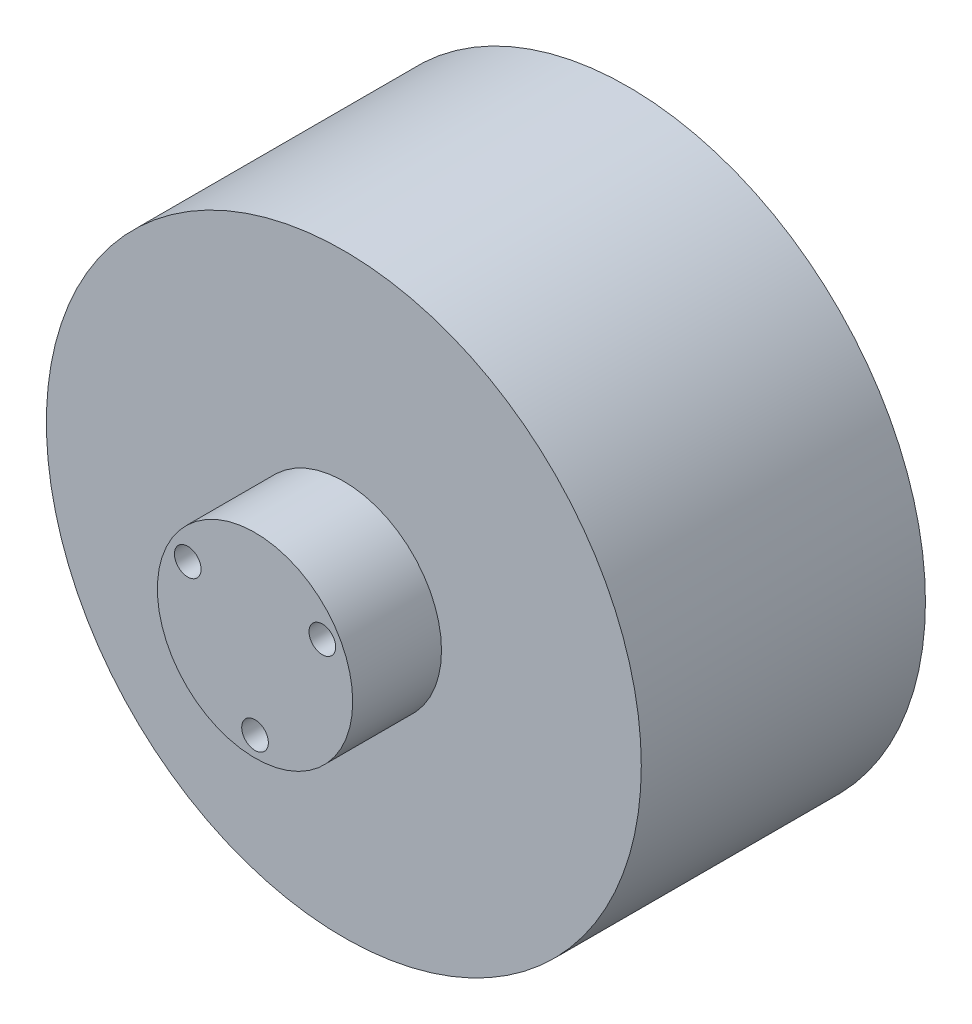
ISO-10303-21;
HEADER;
FILE_DESCRIPTION(('STEP AP214'),'2;1');
FILE_NAME('part.step','',(''),(''),'','','');
FILE_SCHEMA(('AUTOMOTIVE_DESIGN { 1 0 10303 214 1 1 1 1 }'));
ENDSEC;
DATA;
#1=APPLICATION_CONTEXT('core data for automotive mechanical design processes');
#2=APPLICATION_PROTOCOL_DEFINITION('international standard','automotive_design',2000,#1);
#3=PRODUCT_CONTEXT('',#1,'mechanical');
#4=PRODUCT('Part','Part','',(#3));
#5=PRODUCT_RELATED_PRODUCT_CATEGORY('part','',(#4));
#6=PRODUCT_DEFINITION_FORMATION('','',#4);
#7=PRODUCT_DEFINITION_CONTEXT('part definition',#1,'design');
#8=PRODUCT_DEFINITION('design','',#6,#7);
#9=PRODUCT_DEFINITION_SHAPE('','',#8);
#10=(LENGTH_UNIT() NAMED_UNIT(*) SI_UNIT(.MILLI.,.METRE.));
#11=(NAMED_UNIT(*) PLANE_ANGLE_UNIT() SI_UNIT($,.RADIAN.));
#12=(NAMED_UNIT(*) SI_UNIT($,.STERADIAN.) SOLID_ANGLE_UNIT());
#13=UNCERTAINTY_MEASURE_WITH_UNIT(LENGTH_MEASURE(1.E-05),#10,'distance_accuracy_value','');
#14=(GEOMETRIC_REPRESENTATION_CONTEXT(3) GLOBAL_UNCERTAINTY_ASSIGNED_CONTEXT((#13)) GLOBAL_UNIT_ASSIGNED_CONTEXT((#10,
#11,#12)) REPRESENTATION_CONTEXT('',''));
#15=CARTESIAN_POINT('',(0.,0.,0.));
#16=DIRECTION('',(0.,0.,1.));
#17=DIRECTION('',(1.,0.,0.));
#18=AXIS2_PLACEMENT_3D('',#15,#16,#17);
#19=CARTESIAN_POINT('',(0.,0.,2.5));
#20=DIRECTION('',(0.,0.,-1.));
#21=DIRECTION('',(-1.,0.,0.));
#22=AXIS2_PLACEMENT_3D('',#19,#20,#21);
#23=CYLINDRICAL_SURFACE('',#22,16.5);
#24=CARTESIAN_POINT('',(0.,0.,2.5));
#25=DIRECTION('',(0.,0.,1.));
#26=DIRECTION('',(1.,0.,0.));
#27=AXIS2_PLACEMENT_3D('',#24,#25,#26);
#28=CIRCLE('',#27,16.5);
#29=CARTESIAN_POINT('',(16.5,0.,2.5));
#30=VERTEX_POINT('',#29);
#31=EDGE_CURVE('E45',#30,#30,#28,.T.);
#32=ORIENTED_EDGE('',*,*,#31,.F.);
#33=EDGE_LOOP('',(#32));
#34=FACE_BOUND('',#33,.T.);
#35=CARTESIAN_POINT('',(0.,0.,0.));
#36=DIRECTION('',(0.,0.,1.));
#37=DIRECTION('',(1.,0.,0.));
#38=AXIS2_PLACEMENT_3D('',#35,#36,#37);
#39=CIRCLE('',#38,16.5);
#40=CARTESIAN_POINT('',(16.5,0.,0.));
#41=VERTEX_POINT('',#40);
#42=EDGE_CURVE('E40',#41,#41,#39,.T.);
#43=ORIENTED_EDGE('',*,*,#42,.T.);
#44=EDGE_LOOP('',(#43));
#45=FACE_BOUND('',#44,.T.);
#46=ADVANCED_FACE('F37',(#34,#45),#23,.T.);
#47=CARTESIAN_POINT('',(0.,0.,0.));
#48=DIRECTION('',(0.,0.,1.));
#49=DIRECTION('',(1.,0.,0.));
#50=AXIS2_PLACEMENT_3D('',#47,#48,#49);
#51=PLANE('',#50);
#52=CARTESIAN_POINT('',(0.,-14.,0.));
#53=DIRECTION('',(0.,0.,-1.));
#54=DIRECTION('',(-1.,0.,0.));
#55=AXIS2_PLACEMENT_3D('',#52,#53,#54);
#56=CIRCLE('',#55,1.5);
#57=CARTESIAN_POINT('',(-1.5,-14.,0.));
#58=VERTEX_POINT('',#57);
#59=EDGE_CURVE('E101',#58,#58,#56,.T.);
#60=ORIENTED_EDGE('',*,*,#59,.F.);
#61=EDGE_LOOP('',(#60));
#62=FACE_BOUND('',#61,.T.);
#63=CARTESIAN_POINT('',(12.1243556529821,7.00000000000006,0.));
#64=DIRECTION('',(0.,0.,-1.));
#65=DIRECTION('',(-1.,0.,0.));
#66=AXIS2_PLACEMENT_3D('',#63,#64,#65);
#67=CIRCLE('',#66,1.5);
#68=CARTESIAN_POINT('',(10.6243556529821,7.00000000000006,0.));
#69=VERTEX_POINT('',#68);
#70=EDGE_CURVE('E113',#69,#69,#67,.T.);
#71=ORIENTED_EDGE('',*,*,#70,.F.);
#72=EDGE_LOOP('',(#71));
#73=FACE_BOUND('',#72,.T.);
#74=CARTESIAN_POINT('',(-12.1243556529822,6.99999999999989,0.));
#75=DIRECTION('',(0.,0.,-1.));
#76=DIRECTION('',(-1.,0.,0.));
#77=AXIS2_PLACEMENT_3D('',#74,#75,#76);
#78=CIRCLE('',#77,1.5);
#79=CARTESIAN_POINT('',(-13.6243556529822,6.99999999999989,0.));
#80=VERTEX_POINT('',#79);
#81=EDGE_CURVE('E80',#80,#80,#78,.T.);
#82=ORIENTED_EDGE('',*,*,#81,.F.);
#83=EDGE_LOOP('',(#82));
#84=FACE_BOUND('',#83,.T.);
#85=ORIENTED_EDGE('',*,*,#42,.F.);
#86=EDGE_LOOP('',(#85));
#87=FACE_BOUND('',#86,.T.);
#88=ADVANCED_FACE('F127',(#62,#73,#84,#87),#51,.F.);
#89=CARTESIAN_POINT('',(0.,0.,34.5));
#90=DIRECTION('',(0.,0.,-1.));
#91=DIRECTION('',(-1.,0.,0.));
#92=AXIS2_PLACEMENT_3D('',#89,#90,#91);
#93=CYLINDRICAL_SURFACE('',#92,33.5);
#94=CARTESIAN_POINT('',(0.,0.,34.5));
#95=DIRECTION('',(0.,0.,1.));
#96=DIRECTION('',(1.,0.,0.));
#97=AXIS2_PLACEMENT_3D('',#94,#95,#96);
#98=CIRCLE('',#97,33.5);
#99=CARTESIAN_POINT('',(33.5,0.,34.5));
#100=VERTEX_POINT('',#99);
#101=EDGE_CURVE('E55',#100,#100,#98,.T.);
#102=ORIENTED_EDGE('',*,*,#101,.F.);
#103=EDGE_LOOP('',(#102));
#104=FACE_BOUND('',#103,.T.);
#105=CARTESIAN_POINT('',(0.,0.,2.5));
#106=DIRECTION('',(0.,0.,1.));
#107=DIRECTION('',(1.,0.,0.));
#108=AXIS2_PLACEMENT_3D('',#105,#106,#107);
#109=CIRCLE('',#108,33.5);
#110=CARTESIAN_POINT('',(33.5,0.,2.5));
#111=VERTEX_POINT('',#110);
#112=EDGE_CURVE('E59',#111,#111,#109,.T.);
#113=ORIENTED_EDGE('',*,*,#112,.T.);
#114=EDGE_LOOP('',(#113));
#115=FACE_BOUND('',#114,.T.);
#116=ADVANCED_FACE('F130',(#104,#115),#93,.T.);
#117=CARTESIAN_POINT('',(0.,0.,34.5));
#118=DIRECTION('',(0.,0.,1.));
#119=DIRECTION('',(1.,0.,0.));
#120=AXIS2_PLACEMENT_3D('',#117,#118,#119);
#121=PLANE('',#120);
#122=CARTESIAN_POINT('',(0.,0.,34.5));
#123=DIRECTION('',(0.,0.,1.));
#124=DIRECTION('',(1.,0.,0.));
#125=AXIS2_PLACEMENT_3D('',#122,#123,#124);
#126=CIRCLE('',#125,11.);
#127=CARTESIAN_POINT('',(11.,0.,34.5));
#128=VERTEX_POINT('',#127);
#129=EDGE_CURVE('E10',#128,#128,#126,.T.);
#130=ORIENTED_EDGE('',*,*,#129,.F.);
#131=EDGE_LOOP('',(#130));
#132=FACE_BOUND('',#131,.T.);
#133=ORIENTED_EDGE('',*,*,#101,.T.);
#134=EDGE_LOOP('',(#133));
#135=FACE_BOUND('',#134,.T.);
#136=ADVANCED_FACE('F146',(#132,#135),#121,.T.);
#137=CARTESIAN_POINT('',(0.,0.,2.5));
#138=DIRECTION('',(0.,0.,1.));
#139=DIRECTION('',(1.,0.,0.));
#140=AXIS2_PLACEMENT_3D('',#137,#138,#139);
#141=PLANE('',#140);
#142=ORIENTED_EDGE('',*,*,#31,.T.);
#143=EDGE_LOOP('',(#142));
#144=FACE_BOUND('',#143,.T.);
#145=ORIENTED_EDGE('',*,*,#112,.F.);
#146=EDGE_LOOP('',(#145));
#147=FACE_BOUND('',#146,.T.);
#148=ADVANCED_FACE('F142',(#144,#147),#141,.F.);
#149=CARTESIAN_POINT('',(0.,0.,44.5));
#150=DIRECTION('',(0.,0.,-1.));
#151=DIRECTION('',(-1.,0.,0.));
#152=AXIS2_PLACEMENT_3D('',#149,#150,#151);
#153=CYLINDRICAL_SURFACE('',#152,11.);
#154=CARTESIAN_POINT('',(0.,0.,44.5));
#155=DIRECTION('',(0.,0.,1.));
#156=DIRECTION('',(1.,0.,0.));
#157=AXIS2_PLACEMENT_3D('',#154,#155,#156);
#158=CIRCLE('',#157,11.);
#159=CARTESIAN_POINT('',(11.,0.,44.5));
#160=VERTEX_POINT('',#159);
#161=EDGE_CURVE('E53',#160,#160,#158,.T.);
#162=ORIENTED_EDGE('',*,*,#161,.F.);
#163=EDGE_LOOP('',(#162));
#164=FACE_BOUND('',#163,.T.);
#165=ORIENTED_EDGE('',*,*,#129,.T.);
#166=EDGE_LOOP('',(#165));
#167=FACE_BOUND('',#166,.T.);
#168=ADVANCED_FACE('F145',(#164,#167),#153,.T.);
#169=CARTESIAN_POINT('',(0.,0.,44.5));
#170=DIRECTION('',(0.,0.,1.));
#171=DIRECTION('',(1.,0.,0.));
#172=AXIS2_PLACEMENT_3D('',#169,#170,#171);
#173=PLANE('',#172);
#174=CARTESIAN_POINT('',(7.57772228311388,4.37499999999993,44.5));
#175=DIRECTION('',(0.,0.,1.));
#176=DIRECTION('',(1.,0.,0.));
#177=AXIS2_PLACEMENT_3D('',#174,#175,#176);
#178=CIRCLE('',#177,1.5);
#179=CARTESIAN_POINT('',(9.07772228311388,4.37499999999993,44.5));
#180=VERTEX_POINT('',#179);
#181=EDGE_CURVE('E71',#180,#180,#178,.T.);
#182=ORIENTED_EDGE('',*,*,#181,.F.);
#183=EDGE_LOOP('',(#182));
#184=FACE_BOUND('',#183,.T.);
#185=CARTESIAN_POINT('',(-7.57772228311382,4.37500000000004,44.5));
#186=DIRECTION('',(0.,0.,1.));
#187=DIRECTION('',(1.,0.,0.));
#188=AXIS2_PLACEMENT_3D('',#185,#186,#187);
#189=CIRCLE('',#188,1.5);
#190=CARTESIAN_POINT('',(-6.07772228311382,4.37500000000004,44.5));
#191=VERTEX_POINT('',#190);
#192=EDGE_CURVE('E77',#191,#191,#189,.T.);
#193=ORIENTED_EDGE('',*,*,#192,.F.);
#194=EDGE_LOOP('',(#193));
#195=FACE_BOUND('',#194,.T.);
#196=CARTESIAN_POINT('',(0.,-8.75,44.5));
#197=DIRECTION('',(0.,0.,1.));
#198=DIRECTION('',(1.,0.,0.));
#199=AXIS2_PLACEMENT_3D('',#196,#197,#198);
#200=CIRCLE('',#199,1.5);
#201=CARTESIAN_POINT('',(1.5,-8.75,44.5));
#202=VERTEX_POINT('',#201);
#203=EDGE_CURVE('E90',#202,#202,#200,.T.);
#204=ORIENTED_EDGE('',*,*,#203,.F.);
#205=EDGE_LOOP('',(#204));
#206=FACE_BOUND('',#205,.T.);
#207=ORIENTED_EDGE('',*,*,#161,.T.);
#208=EDGE_LOOP('',(#207));
#209=FACE_BOUND('',#208,.T.);
#210=ADVANCED_FACE('F152',(#184,#195,#206,#209),#173,.T.);
#211=CARTESIAN_POINT('',(0.,-8.75,39.5));
#212=DIRECTION('',(0.,0.,1.));
#213=DIRECTION('',(1.,0.,0.));
#214=AXIS2_PLACEMENT_3D('',#211,#212,#213);
#215=CYLINDRICAL_SURFACE('',#214,1.5);
#216=CARTESIAN_POINT('',(0.,-8.75,39.5));
#217=DIRECTION('',(0.,0.,1.));
#218=DIRECTION('',(1.,0.,0.));
#219=AXIS2_PLACEMENT_3D('',#216,#217,#218);
#220=CIRCLE('',#219,1.5);
#221=CARTESIAN_POINT('',(1.5,-8.75,39.5));
#222=VERTEX_POINT('',#221);
#223=EDGE_CURVE('E93',#222,#222,#220,.T.);
#224=ORIENTED_EDGE('',*,*,#223,.F.);
#225=EDGE_LOOP('',(#224));
#226=FACE_BOUND('',#225,.T.);
#227=ORIENTED_EDGE('',*,*,#203,.T.);
#228=EDGE_LOOP('',(#227));
#229=FACE_BOUND('',#228,.T.);
#230=ADVANCED_FACE('F187',(#226,#229),#215,.F.);
#231=CARTESIAN_POINT('',(0.,-8.75,39.5));
#232=DIRECTION('',(0.,0.,1.));
#233=DIRECTION('',(1.,0.,0.));
#234=AXIS2_PLACEMENT_3D('',#231,#232,#233);
#235=PLANE('',#234);
#236=ORIENTED_EDGE('',*,*,#223,.T.);
#237=EDGE_LOOP('',(#236));
#238=FACE_BOUND('',#237,.T.);
#239=ADVANCED_FACE('F197',(#238),#235,.T.);
#240=CARTESIAN_POINT('',(-7.57772228311382,4.37500000000004,39.5));
#241=DIRECTION('',(0.,0.,1.));
#242=DIRECTION('',(1.,0.,0.));
#243=AXIS2_PLACEMENT_3D('',#240,#241,#242);
#244=CYLINDRICAL_SURFACE('',#243,1.5);
#245=CARTESIAN_POINT('',(-7.57772228311382,4.37500000000004,39.5));
#246=DIRECTION('',(0.,0.,1.));
#247=DIRECTION('',(1.,0.,0.));
#248=AXIS2_PLACEMENT_3D('',#245,#246,#247);
#249=CIRCLE('',#248,1.5);
#250=CARTESIAN_POINT('',(-6.07772228311382,4.37500000000004,39.5));
#251=VERTEX_POINT('',#250);
#252=EDGE_CURVE('E86',#251,#251,#249,.T.);
#253=ORIENTED_EDGE('',*,*,#252,.F.);
#254=EDGE_LOOP('',(#253));
#255=FACE_BOUND('',#254,.T.);
#256=ORIENTED_EDGE('',*,*,#192,.T.);
#257=EDGE_LOOP('',(#256));
#258=FACE_BOUND('',#257,.T.);
#259=ADVANCED_FACE('F207',(#255,#258),#244,.F.);
#260=CARTESIAN_POINT('',(0.,0.,39.5));
#261=DIRECTION('',(0.,0.,1.));
#262=DIRECTION('',(1.,0.,0.));
#263=AXIS2_PLACEMENT_3D('',#260,#261,#262);
#264=PLANE('',#263);
#265=ORIENTED_EDGE('',*,*,#252,.T.);
#266=EDGE_LOOP('',(#265));
#267=FACE_BOUND('',#266,.T.);
#268=ADVANCED_FACE('F216',(#267),#264,.T.);
#269=CARTESIAN_POINT('',(7.57772228311388,4.37499999999993,39.5));
#270=DIRECTION('',(0.,0.,1.));
#271=DIRECTION('',(1.,0.,0.));
#272=AXIS2_PLACEMENT_3D('',#269,#270,#271);
#273=CYLINDRICAL_SURFACE('',#272,1.5);
#274=CARTESIAN_POINT('',(7.57772228311388,4.37499999999993,39.5));
#275=DIRECTION('',(0.,0.,1.));
#276=DIRECTION('',(1.,0.,0.));
#277=AXIS2_PLACEMENT_3D('',#274,#275,#276);
#278=CIRCLE('',#277,1.5);
#279=CARTESIAN_POINT('',(9.07772228311388,4.37499999999993,39.5));
#280=VERTEX_POINT('',#279);
#281=EDGE_CURVE('E66',#280,#280,#278,.T.);
#282=ORIENTED_EDGE('',*,*,#281,.F.);
#283=EDGE_LOOP('',(#282));
#284=FACE_BOUND('',#283,.T.);
#285=ORIENTED_EDGE('',*,*,#181,.T.);
#286=EDGE_LOOP('',(#285));
#287=FACE_BOUND('',#286,.T.);
#288=ADVANCED_FACE('F226',(#284,#287),#273,.F.);
#289=CARTESIAN_POINT('',(0.,0.,39.5));
#290=DIRECTION('',(0.,0.,1.));
#291=DIRECTION('',(1.,0.,0.));
#292=AXIS2_PLACEMENT_3D('',#289,#290,#291);
#293=PLANE('',#292);
#294=ORIENTED_EDGE('',*,*,#281,.T.);
#295=EDGE_LOOP('',(#294));
#296=FACE_BOUND('',#295,.T.);
#297=ADVANCED_FACE('F236',(#296),#293,.T.);
#298=CARTESIAN_POINT('',(-12.1243556529822,6.99999999999989,5.));
#299=DIRECTION('',(0.,0.,-1.));
#300=DIRECTION('',(-1.,0.,0.));
#301=AXIS2_PLACEMENT_3D('',#298,#299,#300);
#302=CYLINDRICAL_SURFACE('',#301,1.5);
#303=CARTESIAN_POINT('',(-12.1243556529822,6.99999999999989,5.));
#304=DIRECTION('',(0.,0.,-1.));
#305=DIRECTION('',(-1.,0.,0.));
#306=AXIS2_PLACEMENT_3D('',#303,#304,#305);
#307=CIRCLE('',#306,1.5);
#308=CARTESIAN_POINT('',(-13.6243556529822,6.99999999999989,5.));
#309=VERTEX_POINT('',#308);
#310=EDGE_CURVE('E116',#309,#309,#307,.T.);
#311=ORIENTED_EDGE('',*,*,#310,.F.);
#312=EDGE_LOOP('',(#311));
#313=FACE_BOUND('',#312,.T.);
#314=ORIENTED_EDGE('',*,*,#81,.T.);
#315=EDGE_LOOP('',(#314));
#316=FACE_BOUND('',#315,.T.);
#317=ADVANCED_FACE('F125',(#313,#316),#302,.F.);
#318=CARTESIAN_POINT('',(-12.1243556529822,6.99999999999989,5.));
#319=DIRECTION('',(0.,0.,-1.));
#320=DIRECTION('',(-1.,0.,0.));
#321=AXIS2_PLACEMENT_3D('',#318,#319,#320);
#322=PLANE('',#321);
#323=ORIENTED_EDGE('',*,*,#310,.T.);
#324=EDGE_LOOP('',(#323));
#325=FACE_BOUND('',#324,.T.);
#326=ADVANCED_FACE('F259',(#325),#322,.T.);
#327=CARTESIAN_POINT('',(12.1243556529821,7.00000000000006,5.));
#328=DIRECTION('',(0.,0.,-1.));
#329=DIRECTION('',(-1.,0.,0.));
#330=AXIS2_PLACEMENT_3D('',#327,#328,#329);
#331=CYLINDRICAL_SURFACE('',#330,1.5);
#332=CARTESIAN_POINT('',(12.1243556529821,7.00000000000006,5.));
#333=DIRECTION('',(0.,0.,-1.));
#334=DIRECTION('',(-1.,0.,0.));
#335=AXIS2_PLACEMENT_3D('',#332,#333,#334);
#336=CIRCLE('',#335,1.5);
#337=CARTESIAN_POINT('',(10.6243556529821,7.00000000000006,5.));
#338=VERTEX_POINT('',#337);
#339=EDGE_CURVE('E107',#338,#338,#336,.T.);
#340=ORIENTED_EDGE('',*,*,#339,.F.);
#341=EDGE_LOOP('',(#340));
#342=FACE_BOUND('',#341,.T.);
#343=ORIENTED_EDGE('',*,*,#70,.T.);
#344=EDGE_LOOP('',(#343));
#345=FACE_BOUND('',#344,.T.);
#346=ADVANCED_FACE('F269',(#342,#345),#331,.F.);
#347=CARTESIAN_POINT('',(12.1243556529821,7.00000000000006,5.));
#348=DIRECTION('',(0.,0.,-1.));
#349=DIRECTION('',(-1.,0.,0.));
#350=AXIS2_PLACEMENT_3D('',#347,#348,#349);
#351=PLANE('',#350);
#352=ORIENTED_EDGE('',*,*,#339,.T.);
#353=EDGE_LOOP('',(#352));
#354=FACE_BOUND('',#353,.T.);
#355=ADVANCED_FACE('F278',(#354),#351,.T.);
#356=CARTESIAN_POINT('',(0.,-14.,5.));
#357=DIRECTION('',(0.,0.,-1.));
#358=DIRECTION('',(-1.,0.,0.));
#359=AXIS2_PLACEMENT_3D('',#356,#357,#358);
#360=CYLINDRICAL_SURFACE('',#359,1.5);
#361=CARTESIAN_POINT('',(0.,-14.,5.));
#362=DIRECTION('',(0.,0.,-1.));
#363=DIRECTION('',(-1.,0.,0.));
#364=AXIS2_PLACEMENT_3D('',#361,#362,#363);
#365=CIRCLE('',#364,1.5);
#366=CARTESIAN_POINT('',(-1.5,-14.,5.));
#367=VERTEX_POINT('',#366);
#368=EDGE_CURVE('E96',#367,#367,#365,.T.);
#369=ORIENTED_EDGE('',*,*,#368,.F.);
#370=EDGE_LOOP('',(#369));
#371=FACE_BOUND('',#370,.T.);
#372=ORIENTED_EDGE('',*,*,#59,.T.);
#373=EDGE_LOOP('',(#372));
#374=FACE_BOUND('',#373,.T.);
#375=ADVANCED_FACE('F288',(#371,#374),#360,.F.);
#376=CARTESIAN_POINT('',(0.,-14.,5.));
#377=DIRECTION('',(0.,0.,-1.));
#378=DIRECTION('',(-1.,0.,0.));
#379=AXIS2_PLACEMENT_3D('',#376,#377,#378);
#380=PLANE('',#379);
#381=ORIENTED_EDGE('',*,*,#368,.T.);
#382=EDGE_LOOP('',(#381));
#383=FACE_BOUND('',#382,.T.);
#384=ADVANCED_FACE('F298',(#383),#380,.T.);
#385=CLOSED_SHELL('',(#46,#88,#116,#136,#148,#168,#210,#230,#239,#259,#268,#288,#297,#317,#326,
#346,#355,#375,#384));
#386=MANIFOLD_SOLID_BREP('B2',#385);
#387=ADVANCED_BREP_SHAPE_REPRESENTATION('',(#18,#386),#14);
#388=SHAPE_DEFINITION_REPRESENTATION(#9,#387);
ENDSEC;
END-ISO-10303-21;
